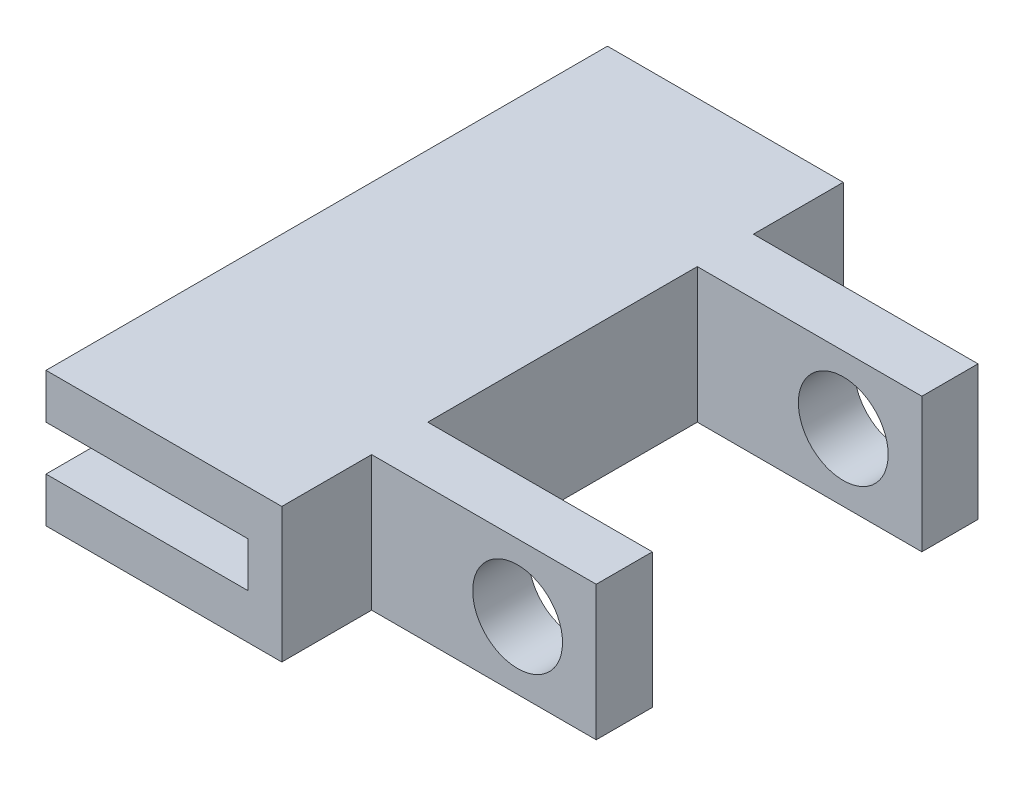
ISO-10303-21;
HEADER;
FILE_DESCRIPTION(('STEP AP214'),'2;1');
FILE_NAME('part.step','',(''),(''),'','','');
FILE_SCHEMA(('AUTOMOTIVE_DESIGN { 1 0 10303 214 1 1 1 1 }'));
ENDSEC;
DATA;
#1=APPLICATION_CONTEXT('core data for automotive mechanical design processes');
#2=APPLICATION_PROTOCOL_DEFINITION('international standard','automotive_design',2000,#1);
#3=PRODUCT_CONTEXT('',#1,'mechanical');
#4=PRODUCT('Part','Part','',(#3));
#5=PRODUCT_RELATED_PRODUCT_CATEGORY('part','',(#4));
#6=PRODUCT_DEFINITION_FORMATION('','',#4);
#7=PRODUCT_DEFINITION_CONTEXT('part definition',#1,'design');
#8=PRODUCT_DEFINITION('design','',#6,#7);
#9=PRODUCT_DEFINITION_SHAPE('','',#8);
#10=(LENGTH_UNIT() NAMED_UNIT(*) SI_UNIT(.MILLI.,.METRE.));
#11=(NAMED_UNIT(*) PLANE_ANGLE_UNIT() SI_UNIT($,.RADIAN.));
#12=(NAMED_UNIT(*) SI_UNIT($,.STERADIAN.) SOLID_ANGLE_UNIT());
#13=UNCERTAINTY_MEASURE_WITH_UNIT(LENGTH_MEASURE(1.E-05),#10,'distance_accuracy_value','');
#14=(GEOMETRIC_REPRESENTATION_CONTEXT(3) GLOBAL_UNCERTAINTY_ASSIGNED_CONTEXT((#13)) GLOBAL_UNIT_ASSIGNED_CONTEXT((#10,
#11,#12)) REPRESENTATION_CONTEXT('',''));
#15=CARTESIAN_POINT('',(0.,0.,0.));
#16=DIRECTION('',(0.,0.,1.));
#17=DIRECTION('',(1.,0.,0.));
#18=AXIS2_PLACEMENT_3D('',#15,#16,#17);
#19=CARTESIAN_POINT('',(8.44668057131574,8.,-25.));
#20=DIRECTION('',(-1.,0.,0.));
#21=DIRECTION('',(0.,-1.,0.));
#22=AXIS2_PLACEMENT_3D('',#19,#20,#21);
#23=PLANE('',#22);
#24=DIRECTION('',(0.,1.,0.));
#25=VECTOR('',#24,1.);
#26=CARTESIAN_POINT('',(8.44668057131574,-4.,-17.));
#27=LINE('',#26,#25);
#28=CARTESIAN_POINT('',(8.44668057131574,-4.,-17.));
#29=VERTEX_POINT('',#28);
#30=CARTESIAN_POINT('',(8.44668057131574,7.99999999999999,-17.));
#31=VERTEX_POINT('',#30);
#32=EDGE_CURVE('E171',#29,#31,#27,.T.);
#33=ORIENTED_EDGE('',*,*,#32,.F.);
#34=DIRECTION('',(0.,0.,1.));
#35=VECTOR('',#34,1.);
#36=CARTESIAN_POINT('',(8.44668057131574,-4.,-25.));
#37=LINE('',#36,#35);
#38=CARTESIAN_POINT('',(8.44668057131574,-4.,-25.));
#39=VERTEX_POINT('',#38);
#40=EDGE_CURVE('E256',#39,#29,#37,.T.);
#41=ORIENTED_EDGE('',*,*,#40,.F.);
#42=DIRECTION('',(0.,-1.,0.));
#43=VECTOR('',#42,1.);
#44=CARTESIAN_POINT('',(8.44668057131574,8.,-25.));
#45=LINE('',#44,#43);
#46=CARTESIAN_POINT('',(8.44668057131574,8.,-25.));
#47=VERTEX_POINT('',#46);
#48=EDGE_CURVE('E233',#47,#39,#45,.T.);
#49=ORIENTED_EDGE('',*,*,#48,.F.);
#50=DIRECTION('',(0.,0.,1.));
#51=VECTOR('',#50,1.);
#52=CARTESIAN_POINT('',(8.44668057131574,8.,-25.));
#53=LINE('',#52,#51);
#54=EDGE_CURVE('E44',#47,#31,#53,.T.);
#55=ORIENTED_EDGE('',*,*,#54,.T.);
#56=EDGE_LOOP('',(#33,#41,#49,#55));
#57=FACE_BOUND('',#56,.T.);
#58=ADVANCED_FACE('F35',(#57),#23,.F.);
#59=DIRECTION('',(0.,-1.,0.));
#60=VECTOR('',#59,1.);
#61=CARTESIAN_POINT('',(8.44668057131574,7.99999999999999,-12.));
#62=LINE('',#61,#60);
#63=CARTESIAN_POINT('',(8.44668057131574,7.99999999999999,-12.));
#64=VERTEX_POINT('',#63);
#65=CARTESIAN_POINT('',(8.44668057131574,-4.,-12.));
#66=VERTEX_POINT('',#65);
#67=EDGE_CURVE('E167',#64,#66,#62,.T.);
#68=ORIENTED_EDGE('',*,*,#67,.F.);
#69=CARTESIAN_POINT('',(8.44668057131574,8.,12.));
#70=VERTEX_POINT('',#69);
#71=EDGE_CURVE('E260',#64,#70,#53,.T.);
#72=ORIENTED_EDGE('',*,*,#71,.T.);
#73=DIRECTION('',(0.,1.,0.));
#74=VECTOR('',#73,1.);
#75=CARTESIAN_POINT('',(8.44668057131574,7.99999999999999,12.));
#76=LINE('',#75,#74);
#77=CARTESIAN_POINT('',(8.44668057131574,-4.,12.));
#78=VERTEX_POINT('',#77);
#79=EDGE_CURVE('E176',#78,#70,#76,.T.);
#80=ORIENTED_EDGE('',*,*,#79,.F.);
#81=EDGE_CURVE('E56',#66,#78,#37,.T.);
#82=ORIENTED_EDGE('',*,*,#81,.F.);
#83=EDGE_LOOP('',(#68,#72,#80,#82));
#84=FACE_BOUND('',#83,.T.);
#85=ADVANCED_FACE('F312',(#84),#23,.F.);
#86=DIRECTION('',(0.,-1.,0.));
#87=VECTOR('',#86,1.);
#88=CARTESIAN_POINT('',(8.44668057131574,-4.,17.));
#89=LINE('',#88,#87);
#90=CARTESIAN_POINT('',(8.44668057131574,8.,17.));
#91=VERTEX_POINT('',#90);
#92=CARTESIAN_POINT('',(8.44668057131574,-4.,17.));
#93=VERTEX_POINT('',#92);
#94=EDGE_CURVE('E173',#91,#93,#89,.T.);
#95=ORIENTED_EDGE('',*,*,#94,.F.);
#96=CARTESIAN_POINT('',(8.44668057131574,8.,25.));
#97=VERTEX_POINT('',#96);
#98=EDGE_CURVE('E259',#91,#97,#53,.T.);
#99=ORIENTED_EDGE('',*,*,#98,.T.);
#100=DIRECTION('',(0.,-1.,0.));
#101=VECTOR('',#100,1.);
#102=CARTESIAN_POINT('',(8.44668057131574,8.,25.));
#103=LINE('',#102,#101);
#104=CARTESIAN_POINT('',(8.44668057131574,-4.,25.));
#105=VERTEX_POINT('',#104);
#106=EDGE_CURVE('E210',#97,#105,#103,.T.);
#107=ORIENTED_EDGE('',*,*,#106,.T.);
#108=EDGE_CURVE('E255',#93,#105,#37,.T.);
#109=ORIENTED_EDGE('',*,*,#108,.F.);
#110=EDGE_LOOP('',(#95,#99,#107,#109));
#111=FACE_BOUND('',#110,.T.);
#112=ADVANCED_FACE('F266',(#111),#23,.F.);
#113=CARTESIAN_POINT('',(-12.5533194286843,4.,-25.));
#114=DIRECTION('',(1.,0.,0.));
#115=DIRECTION('',(0.,0.,-1.));
#116=AXIS2_PLACEMENT_3D('',#113,#114,#115);
#117=PLANE('',#116);
#118=DIRECTION('',(0.,0.,1.));
#119=VECTOR('',#118,1.);
#120=CARTESIAN_POINT('',(-12.5533194286843,4.,-25.));
#121=LINE('',#120,#119);
#122=CARTESIAN_POINT('',(-12.5533194286843,4.,-25.));
#123=VERTEX_POINT('',#122);
#124=CARTESIAN_POINT('',(-12.5533194286843,4.,25.));
#125=VERTEX_POINT('',#124);
#126=EDGE_CURVE('E245',#123,#125,#121,.T.);
#127=ORIENTED_EDGE('',*,*,#126,.T.);
#128=DIRECTION('',(0.,1.,0.));
#129=VECTOR('',#128,1.);
#130=CARTESIAN_POINT('',(-12.5533194286843,4.,25.));
#131=LINE('',#130,#129);
#132=CARTESIAN_POINT('',(-12.5533194286843,8.,25.));
#133=VERTEX_POINT('',#132);
#134=EDGE_CURVE('E204',#125,#133,#131,.T.);
#135=ORIENTED_EDGE('',*,*,#134,.T.);
#136=DIRECTION('',(0.,0.,1.));
#137=VECTOR('',#136,1.);
#138=CARTESIAN_POINT('',(-12.5533194286843,8.,-25.));
#139=LINE('',#138,#137);
#140=CARTESIAN_POINT('',(-12.5533194286843,8.,-25.));
#141=VERTEX_POINT('',#140);
#142=EDGE_CURVE('E11',#141,#133,#139,.T.);
#143=ORIENTED_EDGE('',*,*,#142,.F.);
#144=DIRECTION('',(0.,1.,0.));
#145=VECTOR('',#144,1.);
#146=CARTESIAN_POINT('',(-12.5533194286843,4.,-25.));
#147=LINE('',#146,#145);
#148=EDGE_CURVE('E228',#123,#141,#147,.T.);
#149=ORIENTED_EDGE('',*,*,#148,.F.);
#150=EDGE_LOOP('',(#127,#135,#143,#149));
#151=FACE_BOUND('',#150,.T.);
#152=ADVANCED_FACE('F37',(#151),#117,.F.);
#153=CARTESIAN_POINT('',(-12.5533194286843,8.,-25.));
#154=DIRECTION('',(0.,-1.,0.));
#155=DIRECTION('',(1.,0.,0.));
#156=AXIS2_PLACEMENT_3D('',#153,#154,#155);
#157=PLANE('',#156);
#158=ORIENTED_EDGE('',*,*,#142,.T.);
#159=DIRECTION('',(1.,0.,0.));
#160=VECTOR('',#159,1.);
#161=CARTESIAN_POINT('',(-12.5533194286843,8.,25.));
#162=LINE('',#161,#160);
#163=EDGE_CURVE('E207',#133,#97,#162,.T.);
#164=ORIENTED_EDGE('',*,*,#163,.T.);
#165=ORIENTED_EDGE('',*,*,#98,.F.);
#166=DIRECTION('',(-1.,0.,0.));
#167=VECTOR('',#166,1.);
#168=CARTESIAN_POINT('',(28.4466805713157,7.99999999999999,17.));
#169=LINE('',#168,#167);
#170=CARTESIAN_POINT('',(28.4466805713157,7.99999999999999,17.));
#171=VERTEX_POINT('',#170);
#172=EDGE_CURVE('E201',#171,#91,#169,.T.);
#173=ORIENTED_EDGE('',*,*,#172,.F.);
#174=DIRECTION('',(0.,0.,1.));
#175=VECTOR('',#174,1.);
#176=CARTESIAN_POINT('',(28.4466805713157,7.99999999999999,17.));
#177=LINE('',#176,#175);
#178=CARTESIAN_POINT('',(28.4466805713157,7.99999999999999,12.));
#179=VERTEX_POINT('',#178);
#180=EDGE_CURVE('E181',#179,#171,#177,.T.);
#181=ORIENTED_EDGE('',*,*,#180,.F.);
#182=DIRECTION('',(-1.,0.,0.));
#183=VECTOR('',#182,1.);
#184=CARTESIAN_POINT('',(28.4466805713157,7.99999999999999,12.));
#185=LINE('',#184,#183);
#186=EDGE_CURVE('E189',#179,#70,#185,.T.);
#187=ORIENTED_EDGE('',*,*,#186,.T.);
#188=ORIENTED_EDGE('',*,*,#71,.F.);
#189=DIRECTION('',(-1.,0.,0.));
#190=VECTOR('',#189,1.);
#191=CARTESIAN_POINT('',(28.4466805713157,7.99999999999999,-12.));
#192=LINE('',#191,#190);
#193=CARTESIAN_POINT('',(28.4466805713157,7.99999999999999,-12.));
#194=VERTEX_POINT('',#193);
#195=EDGE_CURVE('E156',#194,#64,#192,.T.);
#196=ORIENTED_EDGE('',*,*,#195,.F.);
#197=DIRECTION('',(0.,0.,1.));
#198=VECTOR('',#197,1.);
#199=CARTESIAN_POINT('',(28.4466805713157,7.99999999999999,-17.));
#200=LINE('',#199,#198);
#201=CARTESIAN_POINT('',(28.4466805713157,7.99999999999999,-17.));
#202=VERTEX_POINT('',#201);
#203=EDGE_CURVE('E148',#202,#194,#200,.T.);
#204=ORIENTED_EDGE('',*,*,#203,.F.);
#205=DIRECTION('',(-1.,0.,0.));
#206=VECTOR('',#205,1.);
#207=CARTESIAN_POINT('',(28.4466805713157,7.99999999999999,-17.));
#208=LINE('',#207,#206);
#209=EDGE_CURVE('E153',#202,#31,#208,.T.);
#210=ORIENTED_EDGE('',*,*,#209,.T.);
#211=ORIENTED_EDGE('',*,*,#54,.F.);
#212=DIRECTION('',(1.,0.,0.));
#213=VECTOR('',#212,1.);
#214=CARTESIAN_POINT('',(-12.5533194286843,8.,-25.));
#215=LINE('',#214,#213);
#216=EDGE_CURVE('E231',#141,#47,#215,.T.);
#217=ORIENTED_EDGE('',*,*,#216,.F.);
#218=EDGE_LOOP('',(#158,#164,#165,#173,#181,#187,#188,#196,#204,#210,#211,#217));
#219=FACE_BOUND('',#218,.T.);
#220=ADVANCED_FACE('F150',(#219),#157,.F.);
#221=CARTESIAN_POINT('',(8.44668057131574,-4.,-25.));
#222=DIRECTION('',(0.,1.,0.));
#223=DIRECTION('',(-1.,0.,0.));
#224=AXIS2_PLACEMENT_3D('',#221,#222,#223);
#225=PLANE('',#224);
#226=ORIENTED_EDGE('',*,*,#40,.T.);
#227=DIRECTION('',(-1.,0.,0.));
#228=VECTOR('',#227,1.);
#229=CARTESIAN_POINT('',(28.4466805713157,-3.99999999999999,-17.));
#230=LINE('',#229,#228);
#231=CARTESIAN_POINT('',(28.4466805713157,-3.99999999999999,-17.));
#232=VERTEX_POINT('',#231);
#233=EDGE_CURVE('E319',#232,#29,#230,.T.);
#234=ORIENTED_EDGE('',*,*,#233,.F.);
#235=DIRECTION('',(0.,0.,-1.));
#236=VECTOR('',#235,1.);
#237=CARTESIAN_POINT('',(28.4466805713157,-3.99999999999999,-12.));
#238=LINE('',#237,#236);
#239=CARTESIAN_POINT('',(28.4466805713157,-3.99999999999999,-12.));
#240=VERTEX_POINT('',#239);
#241=EDGE_CURVE('E164',#240,#232,#238,.T.);
#242=ORIENTED_EDGE('',*,*,#241,.F.);
#243=DIRECTION('',(-1.,0.,0.));
#244=VECTOR('',#243,1.);
#245=CARTESIAN_POINT('',(28.4466805713157,-3.99999999999999,-12.));
#246=LINE('',#245,#244);
#247=EDGE_CURVE('E51',#240,#66,#246,.T.);
#248=ORIENTED_EDGE('',*,*,#247,.T.);
#249=ORIENTED_EDGE('',*,*,#81,.T.);
#250=DIRECTION('',(-1.,0.,0.));
#251=VECTOR('',#250,1.);
#252=CARTESIAN_POINT('',(28.4466805713157,-3.99999999999999,12.));
#253=LINE('',#252,#251);
#254=CARTESIAN_POINT('',(28.4466805713157,-3.99999999999999,12.));
#255=VERTEX_POINT('',#254);
#256=EDGE_CURVE('E195',#255,#78,#253,.T.);
#257=ORIENTED_EDGE('',*,*,#256,.F.);
#258=DIRECTION('',(0.,0.,-1.));
#259=VECTOR('',#258,1.);
#260=CARTESIAN_POINT('',(28.4466805713157,-3.99999999999999,12.));
#261=LINE('',#260,#259);
#262=CARTESIAN_POINT('',(28.4466805713157,-3.99999999999999,17.));
#263=VERTEX_POINT('',#262);
#264=EDGE_CURVE('E186',#263,#255,#261,.T.);
#265=ORIENTED_EDGE('',*,*,#264,.F.);
#266=DIRECTION('',(-1.,0.,0.));
#267=VECTOR('',#266,1.);
#268=CARTESIAN_POINT('',(28.4466805713157,-3.99999999999999,17.));
#269=LINE('',#268,#267);
#270=EDGE_CURVE('E198',#263,#93,#269,.T.);
#271=ORIENTED_EDGE('',*,*,#270,.T.);
#272=ORIENTED_EDGE('',*,*,#108,.T.);
#273=DIRECTION('',(-1.,0.,0.));
#274=VECTOR('',#273,1.);
#275=CARTESIAN_POINT('',(8.44668057131574,-4.,25.));
#276=LINE('',#275,#274);
#277=CARTESIAN_POINT('',(-12.5533194286843,-4.,25.));
#278=VERTEX_POINT('',#277);
#279=EDGE_CURVE('E213',#105,#278,#276,.T.);
#280=ORIENTED_EDGE('',*,*,#279,.T.);
#281=DIRECTION('',(0.,0.,1.));
#282=VECTOR('',#281,1.);
#283=CARTESIAN_POINT('',(-12.5533194286843,-4.,-25.));
#284=LINE('',#283,#282);
#285=CARTESIAN_POINT('',(-12.5533194286843,-4.,-25.));
#286=VERTEX_POINT('',#285);
#287=EDGE_CURVE('E253',#286,#278,#284,.T.);
#288=ORIENTED_EDGE('',*,*,#287,.F.);
#289=DIRECTION('',(-1.,0.,0.));
#290=VECTOR('',#289,1.);
#291=CARTESIAN_POINT('',(8.44668057131574,-4.,-25.));
#292=LINE('',#291,#290);
#293=EDGE_CURVE('E235',#39,#286,#292,.T.);
#294=ORIENTED_EDGE('',*,*,#293,.F.);
#295=EDGE_LOOP('',(#226,#234,#242,#248,#249,#257,#265,#271,#272,#280,#288,#294));
#296=FACE_BOUND('',#295,.T.);
#297=ADVANCED_FACE('F297',(#296),#225,.F.);
#298=CARTESIAN_POINT('',(-12.5533194286843,-4.,-25.));
#299=DIRECTION('',(1.,0.,0.));
#300=DIRECTION('',(0.,0.,-1.));
#301=AXIS2_PLACEMENT_3D('',#298,#299,#300);
#302=PLANE('',#301);
#303=ORIENTED_EDGE('',*,*,#287,.T.);
#304=DIRECTION('',(0.,1.,0.));
#305=VECTOR('',#304,1.);
#306=CARTESIAN_POINT('',(-12.5533194286843,-4.,25.));
#307=LINE('',#306,#305);
#308=CARTESIAN_POINT('',(-12.5533194286843,0.,25.));
#309=VERTEX_POINT('',#308);
#310=EDGE_CURVE('E216',#278,#309,#307,.T.);
#311=ORIENTED_EDGE('',*,*,#310,.T.);
#312=DIRECTION('',(0.,0.,1.));
#313=VECTOR('',#312,1.);
#314=CARTESIAN_POINT('',(-12.5533194286843,0.,-25.));
#315=LINE('',#314,#313);
#316=CARTESIAN_POINT('',(-12.5533194286843,0.,-25.));
#317=VERTEX_POINT('',#316);
#318=EDGE_CURVE('E251',#317,#309,#315,.T.);
#319=ORIENTED_EDGE('',*,*,#318,.F.);
#320=DIRECTION('',(0.,1.,0.));
#321=VECTOR('',#320,1.);
#322=CARTESIAN_POINT('',(-12.5533194286843,-4.,-25.));
#323=LINE('',#322,#321);
#324=EDGE_CURVE('E237',#286,#317,#323,.T.);
#325=ORIENTED_EDGE('',*,*,#324,.F.);
#326=EDGE_LOOP('',(#303,#311,#319,#325));
#327=FACE_BOUND('',#326,.T.);
#328=ADVANCED_FACE('F295',(#327),#302,.F.);
#329=CARTESIAN_POINT('',(-12.5533194286843,0.,-25.));
#330=DIRECTION('',(0.,-1.,0.));
#331=DIRECTION('',(0.,0.,-1.));
#332=AXIS2_PLACEMENT_3D('',#329,#330,#331);
#333=PLANE('',#332);
#334=ORIENTED_EDGE('',*,*,#318,.T.);
#335=DIRECTION('',(1.,0.,0.));
#336=VECTOR('',#335,1.);
#337=CARTESIAN_POINT('',(-12.5533194286843,0.,25.));
#338=LINE('',#337,#336);
#339=CARTESIAN_POINT('',(5.44668057131574,0.,25.));
#340=VERTEX_POINT('',#339);
#341=EDGE_CURVE('E219',#309,#340,#338,.T.);
#342=ORIENTED_EDGE('',*,*,#341,.T.);
#343=DIRECTION('',(0.,0.,1.));
#344=VECTOR('',#343,1.);
#345=CARTESIAN_POINT('',(5.44668057131574,0.,-25.));
#346=LINE('',#345,#344);
#347=CARTESIAN_POINT('',(5.44668057131574,0.,-25.));
#348=VERTEX_POINT('',#347);
#349=EDGE_CURVE('E249',#348,#340,#346,.T.);
#350=ORIENTED_EDGE('',*,*,#349,.F.);
#351=DIRECTION('',(1.,0.,0.));
#352=VECTOR('',#351,1.);
#353=CARTESIAN_POINT('',(-12.5533194286843,0.,-25.));
#354=LINE('',#353,#352);
#355=EDGE_CURVE('E239',#317,#348,#354,.T.);
#356=ORIENTED_EDGE('',*,*,#355,.F.);
#357=EDGE_LOOP('',(#334,#342,#350,#356));
#358=FACE_BOUND('',#357,.T.);
#359=ADVANCED_FACE('F290',(#358),#333,.F.);
#360=CARTESIAN_POINT('',(5.44668057131574,0.,-25.));
#361=DIRECTION('',(1.,0.,0.));
#362=DIRECTION('',(0.,0.,-1.));
#363=AXIS2_PLACEMENT_3D('',#360,#361,#362);
#364=PLANE('',#363);
#365=ORIENTED_EDGE('',*,*,#349,.T.);
#366=DIRECTION('',(0.,1.,0.));
#367=VECTOR('',#366,1.);
#368=CARTESIAN_POINT('',(5.44668057131574,0.,25.));
#369=LINE('',#368,#367);
#370=CARTESIAN_POINT('',(5.44668057131574,4.,25.));
#371=VERTEX_POINT('',#370);
#372=EDGE_CURVE('E222',#340,#371,#369,.T.);
#373=ORIENTED_EDGE('',*,*,#372,.T.);
#374=DIRECTION('',(0.,0.,1.));
#375=VECTOR('',#374,1.);
#376=CARTESIAN_POINT('',(5.44668057131574,4.,-25.));
#377=LINE('',#376,#375);
#378=CARTESIAN_POINT('',(5.44668057131574,4.,-25.));
#379=VERTEX_POINT('',#378);
#380=EDGE_CURVE('E247',#379,#371,#377,.T.);
#381=ORIENTED_EDGE('',*,*,#380,.F.);
#382=DIRECTION('',(0.,1.,0.));
#383=VECTOR('',#382,1.);
#384=CARTESIAN_POINT('',(5.44668057131574,0.,-25.));
#385=LINE('',#384,#383);
#386=EDGE_CURVE('E241',#348,#379,#385,.T.);
#387=ORIENTED_EDGE('',*,*,#386,.F.);
#388=EDGE_LOOP('',(#365,#373,#381,#387));
#389=FACE_BOUND('',#388,.T.);
#390=ADVANCED_FACE('F286',(#389),#364,.F.);
#391=CARTESIAN_POINT('',(5.44668057131574,4.,-25.));
#392=DIRECTION('',(0.,1.,0.));
#393=DIRECTION('',(-1.,0.,0.));
#394=AXIS2_PLACEMENT_3D('',#391,#392,#393);
#395=PLANE('',#394);
#396=ORIENTED_EDGE('',*,*,#380,.T.);
#397=DIRECTION('',(-1.,0.,0.));
#398=VECTOR('',#397,1.);
#399=CARTESIAN_POINT('',(5.44668057131574,4.,25.));
#400=LINE('',#399,#398);
#401=EDGE_CURVE('E225',#371,#125,#400,.T.);
#402=ORIENTED_EDGE('',*,*,#401,.T.);
#403=ORIENTED_EDGE('',*,*,#126,.F.);
#404=DIRECTION('',(-1.,0.,0.));
#405=VECTOR('',#404,1.);
#406=CARTESIAN_POINT('',(5.44668057131574,4.,-25.));
#407=LINE('',#406,#405);
#408=EDGE_CURVE('E243',#379,#123,#407,.T.);
#409=ORIENTED_EDGE('',*,*,#408,.F.);
#410=EDGE_LOOP('',(#396,#402,#403,#409));
#411=FACE_BOUND('',#410,.T.);
#412=ADVANCED_FACE('F281',(#411),#395,.F.);
#413=CARTESIAN_POINT('',(0.,0.,-25.));
#414=DIRECTION('',(0.,0.,-1.));
#415=DIRECTION('',(-1.,0.,0.));
#416=AXIS2_PLACEMENT_3D('',#413,#414,#415);
#417=PLANE('',#416);
#418=ORIENTED_EDGE('',*,*,#148,.T.);
#419=ORIENTED_EDGE('',*,*,#216,.T.);
#420=ORIENTED_EDGE('',*,*,#48,.T.);
#421=ORIENTED_EDGE('',*,*,#293,.T.);
#422=ORIENTED_EDGE('',*,*,#324,.T.);
#423=ORIENTED_EDGE('',*,*,#355,.T.);
#424=ORIENTED_EDGE('',*,*,#386,.T.);
#425=ORIENTED_EDGE('',*,*,#408,.T.);
#426=EDGE_LOOP('',(#418,#419,#420,#421,#422,#423,#424,#425));
#427=FACE_BOUND('',#426,.T.);
#428=ADVANCED_FACE('F378',(#427),#417,.T.);
#429=CARTESIAN_POINT('',(0.,0.,25.));
#430=DIRECTION('',(0.,0.,-1.));
#431=DIRECTION('',(-1.,0.,0.));
#432=AXIS2_PLACEMENT_3D('',#429,#430,#431);
#433=PLANE('',#432);
#434=ORIENTED_EDGE('',*,*,#134,.F.);
#435=ORIENTED_EDGE('',*,*,#401,.F.);
#436=ORIENTED_EDGE('',*,*,#372,.F.);
#437=ORIENTED_EDGE('',*,*,#341,.F.);
#438=ORIENTED_EDGE('',*,*,#310,.F.);
#439=ORIENTED_EDGE('',*,*,#279,.F.);
#440=ORIENTED_EDGE('',*,*,#106,.F.);
#441=ORIENTED_EDGE('',*,*,#163,.F.);
#442=EDGE_LOOP('',(#434,#435,#436,#437,#438,#439,#440,#441));
#443=FACE_BOUND('',#442,.T.);
#444=ADVANCED_FACE('F272',(#443),#433,.F.);
#445=CARTESIAN_POINT('',(28.4466805713157,-3.99999999999999,17.));
#446=DIRECTION('',(0.,0.,-1.));
#447=DIRECTION('',(-1.,0.,0.));
#448=AXIS2_PLACEMENT_3D('',#445,#446,#447);
#449=PLANE('',#448);
#450=CARTESIAN_POINT('',(21.4466805713157,2.,17.));
#451=DIRECTION('',(0.,0.,1.));
#452=DIRECTION('',(1.,0.,0.));
#453=AXIS2_PLACEMENT_3D('',#450,#451,#452);
#454=CIRCLE('',#453,4.);
#455=CARTESIAN_POINT('',(25.4466805713157,2.,17.));
#456=VERTEX_POINT('',#455);
#457=EDGE_CURVE('E327',#456,#456,#454,.T.);
#458=ORIENTED_EDGE('',*,*,#457,.F.);
#459=EDGE_LOOP('',(#458));
#460=FACE_BOUND('',#459,.T.);
#461=ORIENTED_EDGE('',*,*,#94,.T.);
#462=ORIENTED_EDGE('',*,*,#270,.F.);
#463=DIRECTION('',(0.,-1.,0.));
#464=VECTOR('',#463,1.);
#465=CARTESIAN_POINT('',(28.4466805713157,-3.99999999999999,17.));
#466=LINE('',#465,#464);
#467=EDGE_CURVE('E184',#171,#263,#466,.T.);
#468=ORIENTED_EDGE('',*,*,#467,.F.);
#469=ORIENTED_EDGE('',*,*,#172,.T.);
#470=EDGE_LOOP('',(#461,#462,#468,#469));
#471=FACE_BOUND('',#470,.T.);
#472=ADVANCED_FACE('F302',(#460,#471),#449,.F.);
#473=CARTESIAN_POINT('',(28.4466805713157,7.99999999999999,12.));
#474=DIRECTION('',(0.,0.,1.));
#475=DIRECTION('',(0.,-1.,0.));
#476=AXIS2_PLACEMENT_3D('',#473,#474,#475);
#477=PLANE('',#476);
#478=CARTESIAN_POINT('',(21.4466805713157,2.,12.));
#479=DIRECTION('',(0.,0.,1.));
#480=DIRECTION('',(0.,-1.,0.));
#481=AXIS2_PLACEMENT_3D('',#478,#479,#480);
#482=CIRCLE('',#481,4.);
#483=CARTESIAN_POINT('',(25.4466805713157,2.,12.));
#484=VERTEX_POINT('',#483);
#485=EDGE_CURVE('E315',#484,#484,#482,.T.);
#486=ORIENTED_EDGE('',*,*,#485,.T.);
#487=EDGE_LOOP('',(#486));
#488=FACE_BOUND('',#487,.T.);
#489=ORIENTED_EDGE('',*,*,#79,.T.);
#490=ORIENTED_EDGE('',*,*,#186,.F.);
#491=DIRECTION('',(0.,1.,0.));
#492=VECTOR('',#491,1.);
#493=CARTESIAN_POINT('',(28.4466805713157,7.99999999999999,12.));
#494=LINE('',#493,#492);
#495=EDGE_CURVE('E188',#255,#179,#494,.T.);
#496=ORIENTED_EDGE('',*,*,#495,.F.);
#497=ORIENTED_EDGE('',*,*,#256,.T.);
#498=EDGE_LOOP('',(#489,#490,#496,#497));
#499=FACE_BOUND('',#498,.T.);
#500=ADVANCED_FACE('F309',(#488,#499),#477,.F.);
#501=CARTESIAN_POINT('',(28.4466805713157,0.,0.));
#502=DIRECTION('',(-1.,0.,0.));
#503=DIRECTION('',(0.,-1.,0.));
#504=AXIS2_PLACEMENT_3D('',#501,#502,#503);
#505=PLANE('',#504);
#506=ORIENTED_EDGE('',*,*,#180,.T.);
#507=ORIENTED_EDGE('',*,*,#467,.T.);
#508=ORIENTED_EDGE('',*,*,#264,.T.);
#509=ORIENTED_EDGE('',*,*,#495,.T.);
#510=EDGE_LOOP('',(#506,#507,#508,#509));
#511=FACE_BOUND('',#510,.T.);
#512=ADVANCED_FACE('F306',(#511),#505,.F.);
#513=CARTESIAN_POINT('',(28.4466805713157,-3.99999999999999,-17.));
#514=DIRECTION('',(0.,0.,1.));
#515=DIRECTION('',(1.,0.,0.));
#516=AXIS2_PLACEMENT_3D('',#513,#514,#515);
#517=PLANE('',#516);
#518=CARTESIAN_POINT('',(21.4466805713157,2.,-17.));
#519=DIRECTION('',(0.,0.,1.));
#520=DIRECTION('',(1.,0.,0.));
#521=AXIS2_PLACEMENT_3D('',#518,#519,#520);
#522=CIRCLE('',#521,4.);
#523=CARTESIAN_POINT('',(25.4466805713157,2.,-17.));
#524=VERTEX_POINT('',#523);
#525=EDGE_CURVE('E324',#524,#524,#522,.T.);
#526=ORIENTED_EDGE('',*,*,#525,.T.);
#527=EDGE_LOOP('',(#526));
#528=FACE_BOUND('',#527,.T.);
#529=ORIENTED_EDGE('',*,*,#32,.T.);
#530=ORIENTED_EDGE('',*,*,#209,.F.);
#531=DIRECTION('',(0.,1.,0.));
#532=VECTOR('',#531,1.);
#533=CARTESIAN_POINT('',(28.4466805713157,-3.99999999999999,-17.));
#534=LINE('',#533,#532);
#535=EDGE_CURVE('E160',#232,#202,#534,.T.);
#536=ORIENTED_EDGE('',*,*,#535,.F.);
#537=ORIENTED_EDGE('',*,*,#233,.T.);
#538=EDGE_LOOP('',(#529,#530,#536,#537));
#539=FACE_BOUND('',#538,.T.);
#540=ADVANCED_FACE('F169',(#528,#539),#517,.F.);
#541=CARTESIAN_POINT('',(28.4466805713157,7.99999999999999,-12.));
#542=DIRECTION('',(0.,0.,-1.));
#543=DIRECTION('',(0.,1.,0.));
#544=AXIS2_PLACEMENT_3D('',#541,#542,#543);
#545=PLANE('',#544);
#546=CARTESIAN_POINT('',(21.4466805713157,2.,-12.));
#547=DIRECTION('',(0.,0.,-1.));
#548=DIRECTION('',(0.,1.,0.));
#549=AXIS2_PLACEMENT_3D('',#546,#547,#548);
#550=CIRCLE('',#549,4.);
#551=CARTESIAN_POINT('',(25.4466805713157,2.,-12.));
#552=VERTEX_POINT('',#551);
#553=EDGE_CURVE('E39',#552,#552,#550,.T.);
#554=ORIENTED_EDGE('',*,*,#553,.T.);
#555=EDGE_LOOP('',(#554));
#556=FACE_BOUND('',#555,.T.);
#557=ORIENTED_EDGE('',*,*,#67,.T.);
#558=ORIENTED_EDGE('',*,*,#247,.F.);
#559=DIRECTION('',(0.,-1.,0.));
#560=VECTOR('',#559,1.);
#561=CARTESIAN_POINT('',(28.4466805713157,7.99999999999999,-12.));
#562=LINE('',#561,#560);
#563=EDGE_CURVE('E159',#194,#240,#562,.T.);
#564=ORIENTED_EDGE('',*,*,#563,.F.);
#565=ORIENTED_EDGE('',*,*,#195,.T.);
#566=EDGE_LOOP('',(#557,#558,#564,#565));
#567=FACE_BOUND('',#566,.T.);
#568=ADVANCED_FACE('F334',(#556,#567),#545,.F.);
#569=CARTESIAN_POINT('',(28.4466805713157,0.,0.));
#570=DIRECTION('',(1.,0.,0.));
#571=DIRECTION('',(0.,1.,0.));
#572=AXIS2_PLACEMENT_3D('',#569,#570,#571);
#573=PLANE('',#572);
#574=ORIENTED_EDGE('',*,*,#535,.T.);
#575=ORIENTED_EDGE('',*,*,#203,.T.);
#576=ORIENTED_EDGE('',*,*,#563,.T.);
#577=ORIENTED_EDGE('',*,*,#241,.T.);
#578=EDGE_LOOP('',(#574,#575,#576,#577));
#579=FACE_BOUND('',#578,.T.);
#580=ADVANCED_FACE('F163',(#579),#573,.T.);
#581=CARTESIAN_POINT('',(21.4466805713157,2.,-24.));
#582=DIRECTION('',(0.,0.,1.));
#583=DIRECTION('',(1.,0.,0.));
#584=AXIS2_PLACEMENT_3D('',#581,#582,#583);
#585=CYLINDRICAL_SURFACE('',#584,4.);
#586=CARTESIAN_POINT('',(25.4466805713157,2.,-12.));
#587=CARTESIAN_POINT('',(25.4466805713157,2.,-12.0520833333333));
#588=CARTESIAN_POINT('',(25.4466805713157,2.,-12.1041666666667));
#589=CARTESIAN_POINT('',(25.4466805713157,2.,-12.2083333333333));
#590=CARTESIAN_POINT('',(25.4466805713157,2.,-12.2604166666667));
#591=CARTESIAN_POINT('',(25.4466805713157,2.,-12.3645833333333));
#592=CARTESIAN_POINT('',(25.4466805713157,2.,-12.4166666666667));
#593=CARTESIAN_POINT('',(25.4466805713157,2.,-12.5208333333333));
#594=CARTESIAN_POINT('',(25.4466805713157,2.,-12.5729166666667));
#595=CARTESIAN_POINT('',(25.4466805713157,2.,-12.6770833333333));
#596=CARTESIAN_POINT('',(25.4466805713157,2.,-12.7291666666667));
#597=CARTESIAN_POINT('',(25.4466805713157,2.,-12.8333333333333));
#598=CARTESIAN_POINT('',(25.4466805713157,2.,-12.8854166666667));
#599=CARTESIAN_POINT('',(25.4466805713157,2.,-12.9895833333333));
#600=CARTESIAN_POINT('',(25.4466805713157,2.,-13.0416666666667));
#601=CARTESIAN_POINT('',(25.4466805713157,2.,-13.1458333333333));
#602=CARTESIAN_POINT('',(25.4466805713157,2.,-13.1979166666667));
#603=CARTESIAN_POINT('',(25.4466805713157,2.,-13.3020833333333));
#604=CARTESIAN_POINT('',(25.4466805713157,2.,-13.3541666666667));
#605=CARTESIAN_POINT('',(25.4466805713157,2.,-13.4583333333333));
#606=CARTESIAN_POINT('',(25.4466805713157,2.,-13.5104166666667));
#607=CARTESIAN_POINT('',(25.4466805713157,2.,-13.6145833333333));
#608=CARTESIAN_POINT('',(25.4466805713157,2.,-13.6666666666667));
#609=CARTESIAN_POINT('',(25.4466805713157,2.,-13.7708333333333));
#610=CARTESIAN_POINT('',(25.4466805713157,2.,-13.8229166666667));
#611=CARTESIAN_POINT('',(25.4466805713157,2.,-13.9270833333333));
#612=CARTESIAN_POINT('',(25.4466805713157,2.,-13.9791666666667));
#613=CARTESIAN_POINT('',(25.4466805713157,2.,-14.0833333333333));
#614=CARTESIAN_POINT('',(25.4466805713157,2.,-14.1354166666667));
#615=CARTESIAN_POINT('',(25.4466805713157,2.,-14.2395833333333));
#616=CARTESIAN_POINT('',(25.4466805713157,2.,-14.2916666666667));
#617=CARTESIAN_POINT('',(25.4466805713157,2.,-14.3958333333333));
#618=CARTESIAN_POINT('',(25.4466805713157,2.,-14.4479166666667));
#619=CARTESIAN_POINT('',(25.4466805713157,2.,-14.5520833333333));
#620=CARTESIAN_POINT('',(25.4466805713157,2.,-14.6041666666667));
#621=CARTESIAN_POINT('',(25.4466805713157,2.,-14.7083333333333));
#622=CARTESIAN_POINT('',(25.4466805713157,2.,-14.7604166666667));
#623=CARTESIAN_POINT('',(25.4466805713157,2.,-14.8645833333333));
#624=CARTESIAN_POINT('',(25.4466805713157,2.,-14.9166666666667));
#625=CARTESIAN_POINT('',(25.4466805713157,2.,-15.0208333333333));
#626=CARTESIAN_POINT('',(25.4466805713157,2.,-15.0729166666667));
#627=CARTESIAN_POINT('',(25.4466805713157,2.,-15.1770833333333));
#628=CARTESIAN_POINT('',(25.4466805713157,2.,-15.2291666666667));
#629=CARTESIAN_POINT('',(25.4466805713157,2.,-15.3333333333333));
#630=CARTESIAN_POINT('',(25.4466805713157,2.,-15.3854166666667));
#631=CARTESIAN_POINT('',(25.4466805713157,2.,-15.4895833333333));
#632=CARTESIAN_POINT('',(25.4466805713157,2.,-15.5416666666667));
#633=CARTESIAN_POINT('',(25.4466805713157,2.,-15.6458333333333));
#634=CARTESIAN_POINT('',(25.4466805713157,2.,-15.6979166666667));
#635=CARTESIAN_POINT('',(25.4466805713157,2.,-15.8020833333333));
#636=CARTESIAN_POINT('',(25.4466805713157,2.,-15.8541666666667));
#637=CARTESIAN_POINT('',(25.4466805713157,2.,-15.9583333333333));
#638=CARTESIAN_POINT('',(25.4466805713157,2.,-16.0104166666667));
#639=CARTESIAN_POINT('',(25.4466805713157,2.,-16.1145833333333));
#640=CARTESIAN_POINT('',(25.4466805713157,2.,-16.1666666666667));
#641=CARTESIAN_POINT('',(25.4466805713157,2.,-16.2708333333333));
#642=CARTESIAN_POINT('',(25.4466805713157,2.,-16.3229166666667));
#643=CARTESIAN_POINT('',(25.4466805713157,2.,-16.4270833333333));
#644=CARTESIAN_POINT('',(25.4466805713157,2.,-16.4791666666667));
#645=CARTESIAN_POINT('',(25.4466805713157,2.,-16.5833333333333));
#646=CARTESIAN_POINT('',(25.4466805713157,2.,-16.6354166666667));
#647=CARTESIAN_POINT('',(25.4466805713157,2.,-16.7395833333333));
#648=CARTESIAN_POINT('',(25.4466805713157,2.,-16.7916666666667));
#649=CARTESIAN_POINT('',(25.4466805713157,2.,-16.8958333333333));
#650=CARTESIAN_POINT('',(25.4466805713157,2.,-16.9479166666667));
#651=CARTESIAN_POINT('',(25.4466805713157,2.,-17.));
#652=B_SPLINE_CURVE_WITH_KNOTS('',3,(#586,#587,#588,#589,#590,#591,#592,#593,#594,#595,#596,
#597,#598,#599,#600,#601,#602,#603,#604,#605,#606,#607,#608,#609,#610,#611,#612,#613,#614,#615,
#616,#617,#618,#619,#620,#621,#622,#623,#624,#625,#626,#627,#628,#629,#630,#631,#632,#633,#634,
#635,#636,#637,#638,#639,#640,#641,#642,#643,#644,#645,#646,#647,#648,#649,#650,#651),
.UNSPECIFIED.,.F.,.F.,(4,2,2,2,2,2,2,2,2,2,2,2,2,2,2,2,2,2,2,2,2,2,2,2,2,2,2,2,2,2,2,2,4),(0.,
0.15625,0.3125,0.46875,0.625000000000001,0.781250000000001,0.937500000000001,1.09375,1.25,
1.40625,1.5625,1.71875,1.875,2.03125,2.1875,2.34375,2.5,2.65625,2.8125,2.96875,3.125,3.28125,
3.4375,3.59375,3.75,3.90625,4.0625,4.21875,4.375,4.53125,4.6875,4.84375,5.),.UNSPECIFIED.);
#653=EDGE_CURVE('BSEAM336',#552,#524,#652,.T.);
#654=ORIENTED_EDGE('',*,*,#553,.F.);
#655=ORIENTED_EDGE('',*,*,#525,.F.);
#656=ORIENTED_EDGE('',*,*,#653,.T.);
#657=ORIENTED_EDGE('',*,*,#653,.F.);
#658=EDGE_LOOP('',(#654,#656,#655,#657));
#659=FACE_BOUND('',#658,.T.);
#660=ADVANCED_FACE('F336',(#659),#585,.F.);
#661=CARTESIAN_POINT('',(25.4466805713157,2.,17.));
#662=CARTESIAN_POINT('',(25.4466805713157,2.,16.9479166666667));
#663=CARTESIAN_POINT('',(25.4466805713157,2.,16.8958333333333));
#664=CARTESIAN_POINT('',(25.4466805713157,2.,16.7916666666667));
#665=CARTESIAN_POINT('',(25.4466805713157,2.,16.7395833333333));
#666=CARTESIAN_POINT('',(25.4466805713157,2.,16.6354166666667));
#667=CARTESIAN_POINT('',(25.4466805713157,2.,16.5833333333333));
#668=CARTESIAN_POINT('',(25.4466805713157,2.,16.4791666666667));
#669=CARTESIAN_POINT('',(25.4466805713157,2.,16.4270833333333));
#670=CARTESIAN_POINT('',(25.4466805713157,2.,16.3229166666667));
#671=CARTESIAN_POINT('',(25.4466805713157,2.,16.2708333333333));
#672=CARTESIAN_POINT('',(25.4466805713157,2.,16.1666666666667));
#673=CARTESIAN_POINT('',(25.4466805713157,2.,16.1145833333333));
#674=CARTESIAN_POINT('',(25.4466805713157,2.,16.0104166666667));
#675=CARTESIAN_POINT('',(25.4466805713157,2.,15.9583333333333));
#676=CARTESIAN_POINT('',(25.4466805713157,2.,15.8541666666667));
#677=CARTESIAN_POINT('',(25.4466805713157,2.,15.8020833333333));
#678=CARTESIAN_POINT('',(25.4466805713157,2.,15.6979166666667));
#679=CARTESIAN_POINT('',(25.4466805713157,2.,15.6458333333333));
#680=CARTESIAN_POINT('',(25.4466805713157,2.,15.5416666666667));
#681=CARTESIAN_POINT('',(25.4466805713157,2.,15.4895833333333));
#682=CARTESIAN_POINT('',(25.4466805713157,2.,15.3854166666667));
#683=CARTESIAN_POINT('',(25.4466805713157,2.,15.3333333333333));
#684=CARTESIAN_POINT('',(25.4466805713157,2.,15.2291666666667));
#685=CARTESIAN_POINT('',(25.4466805713157,2.,15.1770833333333));
#686=CARTESIAN_POINT('',(25.4466805713157,2.,15.0729166666667));
#687=CARTESIAN_POINT('',(25.4466805713157,2.,15.0208333333333));
#688=CARTESIAN_POINT('',(25.4466805713157,2.,14.9166666666667));
#689=CARTESIAN_POINT('',(25.4466805713157,2.,14.8645833333333));
#690=CARTESIAN_POINT('',(25.4466805713157,2.,14.7604166666667));
#691=CARTESIAN_POINT('',(25.4466805713157,2.,14.7083333333333));
#692=CARTESIAN_POINT('',(25.4466805713157,2.,14.6041666666667));
#693=CARTESIAN_POINT('',(25.4466805713157,2.,14.5520833333333));
#694=CARTESIAN_POINT('',(25.4466805713157,2.,14.4479166666667));
#695=CARTESIAN_POINT('',(25.4466805713157,2.,14.3958333333333));
#696=CARTESIAN_POINT('',(25.4466805713157,2.,14.2916666666667));
#697=CARTESIAN_POINT('',(25.4466805713157,2.,14.2395833333333));
#698=CARTESIAN_POINT('',(25.4466805713157,2.,14.1354166666667));
#699=CARTESIAN_POINT('',(25.4466805713157,2.,14.0833333333333));
#700=CARTESIAN_POINT('',(25.4466805713157,2.,13.9791666666667));
#701=CARTESIAN_POINT('',(25.4466805713157,2.,13.9270833333333));
#702=CARTESIAN_POINT('',(25.4466805713157,2.,13.8229166666667));
#703=CARTESIAN_POINT('',(25.4466805713157,2.,13.7708333333333));
#704=CARTESIAN_POINT('',(25.4466805713157,2.,13.6666666666667));
#705=CARTESIAN_POINT('',(25.4466805713157,2.,13.6145833333333));
#706=CARTESIAN_POINT('',(25.4466805713157,2.,13.5104166666667));
#707=CARTESIAN_POINT('',(25.4466805713157,2.,13.4583333333333));
#708=CARTESIAN_POINT('',(25.4466805713157,2.,13.3541666666667));
#709=CARTESIAN_POINT('',(25.4466805713157,2.,13.3020833333333));
#710=CARTESIAN_POINT('',(25.4466805713157,2.,13.1979166666667));
#711=CARTESIAN_POINT('',(25.4466805713157,2.,13.1458333333333));
#712=CARTESIAN_POINT('',(25.4466805713157,2.,13.0416666666667));
#713=CARTESIAN_POINT('',(25.4466805713157,2.,12.9895833333333));
#714=CARTESIAN_POINT('',(25.4466805713157,2.,12.8854166666667));
#715=CARTESIAN_POINT('',(25.4466805713157,2.,12.8333333333333));
#716=CARTESIAN_POINT('',(25.4466805713157,2.,12.7291666666667));
#717=CARTESIAN_POINT('',(25.4466805713157,2.,12.6770833333333));
#718=CARTESIAN_POINT('',(25.4466805713157,2.,12.5729166666667));
#719=CARTESIAN_POINT('',(25.4466805713157,2.,12.5208333333333));
#720=CARTESIAN_POINT('',(25.4466805713157,2.,12.4166666666667));
#721=CARTESIAN_POINT('',(25.4466805713157,2.,12.3645833333333));
#722=CARTESIAN_POINT('',(25.4466805713157,2.,12.2604166666667));
#723=CARTESIAN_POINT('',(25.4466805713157,2.,12.2083333333333));
#724=CARTESIAN_POINT('',(25.4466805713157,2.,12.1041666666667));
#725=CARTESIAN_POINT('',(25.4466805713157,2.,12.0520833333333));
#726=CARTESIAN_POINT('',(25.4466805713157,2.,12.));
#727=B_SPLINE_CURVE_WITH_KNOTS('',3,(#661,#662,#663,#664,#665,#666,#667,#668,#669,#670,#671,
#672,#673,#674,#675,#676,#677,#678,#679,#680,#681,#682,#683,#684,#685,#686,#687,#688,#689,#690,
#691,#692,#693,#694,#695,#696,#697,#698,#699,#700,#701,#702,#703,#704,#705,#706,#707,#708,#709,
#710,#711,#712,#713,#714,#715,#716,#717,#718,#719,#720,#721,#722,#723,#724,#725,#726),
.UNSPECIFIED.,.F.,.F.,(4,2,2,2,2,2,2,2,2,2,2,2,2,2,2,2,2,2,2,2,2,2,2,2,2,2,2,2,2,2,2,2,4),(0.,
0.156249999999997,0.3125,0.468749999999997,0.625000000000001,0.781249999999997,
0.937500000000001,1.09375,1.25,1.40625,1.56249999999999,1.71875,1.87499999999999,2.03125,2.1875,
2.34375,2.5,2.65624999999999,2.8125,2.96874999999999,3.125,3.28124999999999,3.4375,
3.59374999999999,3.74999999999999,3.90624999999999,4.06249999999999,4.21874999999999,
4.37499999999999,4.53124999999999,4.68749999999999,4.84374999999999,4.99999999999999),.UNSPECIFIED.);
#728=EDGE_CURVE('BSEAM339',#456,#484,#727,.T.);
#729=ORIENTED_EDGE('',*,*,#457,.T.);
#730=ORIENTED_EDGE('',*,*,#485,.F.);
#731=ORIENTED_EDGE('',*,*,#728,.T.);
#732=ORIENTED_EDGE('',*,*,#728,.F.);
#733=EDGE_LOOP('',(#729,#731,#730,#732));
#734=FACE_BOUND('',#733,.T.);
#735=ADVANCED_FACE('F339',(#734),#585,.F.);
#736=CLOSED_SHELL('',(#58,#85,#112,#152,#220,#297,#328,#359,#390,#412,#428,#444,#472,#500,#512,
#540,#568,#580,#660,#735));
#737=MANIFOLD_SOLID_BREP('B2',#736);
#738=ADVANCED_BREP_SHAPE_REPRESENTATION('',(#18,#737),#14);
#739=SHAPE_DEFINITION_REPRESENTATION(#9,#738);
ENDSEC;
END-ISO-10303-21;
